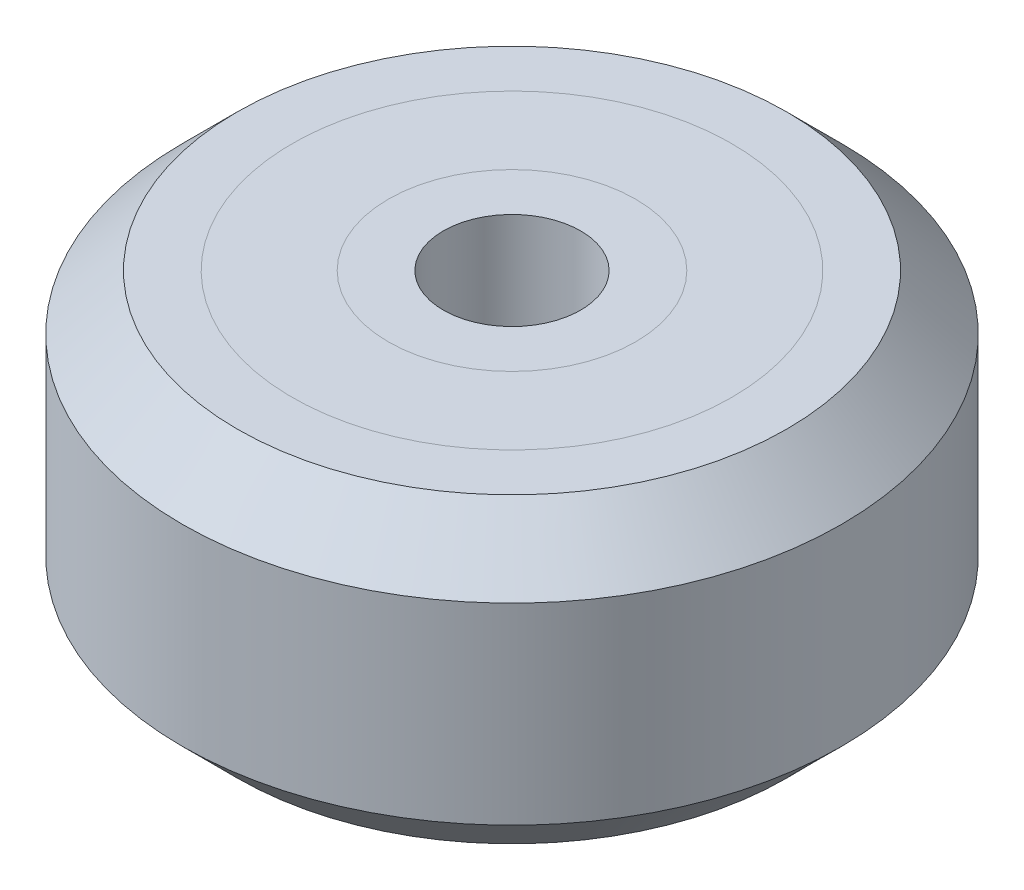
ISO-10303-21;
HEADER;
FILE_DESCRIPTION(('STEP AP214'),'2;1');
FILE_NAME('part.step','',(''),(''),'','','');
FILE_SCHEMA(('AUTOMOTIVE_DESIGN { 1 0 10303 214 1 1 1 1 }'));
ENDSEC;
DATA;
#1=APPLICATION_CONTEXT('core data for automotive mechanical design processes');
#2=APPLICATION_PROTOCOL_DEFINITION('international standard','automotive_design',2000,#1);
#3=PRODUCT_CONTEXT('',#1,'mechanical');
#4=PRODUCT('Part','Part','',(#3));
#5=PRODUCT_RELATED_PRODUCT_CATEGORY('part','',(#4));
#6=PRODUCT_DEFINITION_FORMATION('','',#4);
#7=PRODUCT_DEFINITION_CONTEXT('part definition',#1,'design');
#8=PRODUCT_DEFINITION('design','',#6,#7);
#9=PRODUCT_DEFINITION_SHAPE('','',#8);
#10=(LENGTH_UNIT() NAMED_UNIT(*) SI_UNIT(.MILLI.,.METRE.));
#11=(NAMED_UNIT(*) PLANE_ANGLE_UNIT() SI_UNIT($,.RADIAN.));
#12=(NAMED_UNIT(*) SI_UNIT($,.STERADIAN.) SOLID_ANGLE_UNIT());
#13=UNCERTAINTY_MEASURE_WITH_UNIT(LENGTH_MEASURE(1.E-05),#10,'distance_accuracy_value','');
#14=(GEOMETRIC_REPRESENTATION_CONTEXT(3) GLOBAL_UNCERTAINTY_ASSIGNED_CONTEXT((#13)) GLOBAL_UNIT_ASSIGNED_CONTEXT((#10,
#11,#12)) REPRESENTATION_CONTEXT('',''));
#15=CARTESIAN_POINT('',(0.,0.,0.));
#16=DIRECTION('',(0.,0.,1.));
#17=DIRECTION('',(1.,0.,0.));
#18=AXIS2_PLACEMENT_3D('',#15,#16,#17);
#19=CARTESIAN_POINT('',(0.,0.,0.));
#20=DIRECTION('',(0.,1.,0.));
#21=DIRECTION('',(1.,0.,0.));
#22=AXIS2_PLACEMENT_3D('',#19,#20,#21);
#23=CYLINDRICAL_SURFACE('',#22,2.5);
#24=CARTESIAN_POINT('',(0.,11.,0.));
#25=DIRECTION('',(0.,-1.,0.));
#26=DIRECTION('',(1.,0.,0.));
#27=AXIS2_PLACEMENT_3D('',#24,#25,#26);
#28=CIRCLE('',#27,2.5);
#29=CARTESIAN_POINT('',(-2.5,11.,0.));
#30=VERTEX_POINT('',#29);
#31=EDGE_CURVE('P0_E25',#30,#30,#28,.T.);
#32=ORIENTED_EDGE('',*,*,#31,.F.);
#33=DIRECTION('',(0.,-1.,0.));
#34=VECTOR('',#33,1.);
#35=CARTESIAN_POINT('',(-2.5,0.,0.));
#36=LINE('',#35,#34);
#37=CARTESIAN_POINT('',(-2.5,0.,0.));
#38=VERTEX_POINT('',#37);
#39=EDGE_CURVE('P0_E11',#30,#38,#36,.T.);
#40=ORIENTED_EDGE('',*,*,#39,.T.);
#41=CARTESIAN_POINT('',(0.,0.,0.));
#42=DIRECTION('',(0.,-1.,0.));
#43=DIRECTION('',(1.,0.,0.));
#44=AXIS2_PLACEMENT_3D('',#41,#42,#43);
#45=CIRCLE('',#44,2.5);
#46=EDGE_CURVE('P0_E70',#38,#38,#45,.T.);
#47=ORIENTED_EDGE('',*,*,#46,.T.);
#48=ORIENTED_EDGE('',*,*,#39,.F.);
#49=EDGE_LOOP('',(#32,#40,#47,#48));
#50=FACE_BOUND('',#49,.T.);
#51=ADVANCED_FACE('P0_F17',(#50),#23,.F.);
#52=CARTESIAN_POINT('',(0.,11.,0.));
#53=DIRECTION('',(0.,1.,0.));
#54=DIRECTION('',(1.,0.,0.));
#55=AXIS2_PLACEMENT_3D('',#52,#53,#54);
#56=PLANE('',#55);
#57=ORIENTED_EDGE('',*,*,#31,.T.);
#58=EDGE_LOOP('',(#57));
#59=FACE_BOUND('',#58,.T.);
#60=CARTESIAN_POINT('',(0.,11.,0.));
#61=DIRECTION('',(0.,1.,0.));
#62=DIRECTION('',(-1.,0.,0.));
#63=AXIS2_PLACEMENT_3D('',#60,#61,#62);
#64=CIRCLE('',#63,4.5);
#65=CARTESIAN_POINT('',(4.5,11.,0.));
#66=VERTEX_POINT('',#65);
#67=EDGE_CURVE('P0_E54',#66,#66,#64,.T.);
#68=ORIENTED_EDGE('',*,*,#67,.T.);
#69=EDGE_LOOP('',(#68));
#70=FACE_BOUND('',#69,.T.);
#71=ADVANCED_FACE('P0_F58',(#59,#70),#56,.T.);
#72=CARTESIAN_POINT('',(0.,0.,0.));
#73=DIRECTION('',(0.,1.,0.));
#74=DIRECTION('',(1.,0.,0.));
#75=AXIS2_PLACEMENT_3D('',#72,#73,#74);
#76=PLANE('',#75);
#77=ORIENTED_EDGE('',*,*,#46,.F.);
#78=EDGE_LOOP('',(#77));
#79=FACE_BOUND('',#78,.T.);
#80=CARTESIAN_POINT('',(0.,0.,0.));
#81=DIRECTION('',(0.,-1.,0.));
#82=DIRECTION('',(-1.,0.,0.));
#83=AXIS2_PLACEMENT_3D('',#80,#81,#82);
#84=CIRCLE('',#83,4.5);
#85=CARTESIAN_POINT('',(4.5,0.,0.));
#86=VERTEX_POINT('',#85);
#87=EDGE_CURVE('P0_E57',#86,#86,#84,.T.);
#88=ORIENTED_EDGE('',*,*,#87,.T.);
#89=EDGE_LOOP('',(#88));
#90=FACE_BOUND('',#89,.T.);
#91=ADVANCED_FACE('P0_F73',(#79,#90),#76,.F.);
#92=CARTESIAN_POINT('',(0.,11.,0.));
#93=DIRECTION('',(0.,-1.,0.));
#94=DIRECTION('',(-1.,0.,0.));
#95=AXIS2_PLACEMENT_3D('',#92,#93,#94);
#96=CYLINDRICAL_SURFACE('',#95,4.5);
#97=ORIENTED_EDGE('',*,*,#67,.F.);
#98=DIRECTION('',(0.,-1.,0.));
#99=VECTOR('',#98,1.);
#100=CARTESIAN_POINT('',(4.5,11.,0.));
#101=LINE('',#100,#99);
#102=EDGE_CURVE('P0_E55',#66,#86,#101,.T.);
#103=ORIENTED_EDGE('',*,*,#102,.T.);
#104=ORIENTED_EDGE('',*,*,#87,.F.);
#105=ORIENTED_EDGE('',*,*,#102,.F.);
#106=EDGE_LOOP('',(#97,#103,#104,#105));
#107=FACE_BOUND('',#106,.T.);
#108=ADVANCED_FACE('P0_F53',(#107),#96,.T.);
#109=CLOSED_SHELL('',(#51,#71,#91,#108));
#110=MANIFOLD_SOLID_BREP('P0_B1',#109);
#111=CARTESIAN_POINT('',(0.,11.,0.));
#112=DIRECTION('',(0.,-1.,0.));
#113=DIRECTION('',(-1.,0.,0.));
#114=AXIS2_PLACEMENT_3D('',#111,#112,#113);
#115=CYLINDRICAL_SURFACE('',#114,8.);
#116=CARTESIAN_POINT('',(0.,11.,0.));
#117=DIRECTION('',(0.,-1.,0.));
#118=DIRECTION('',(-1.,0.,0.));
#119=AXIS2_PLACEMENT_3D('',#116,#117,#118);
#120=CIRCLE('',#119,8.);
#121=CARTESIAN_POINT('',(8.,11.,0.));
#122=VERTEX_POINT('',#121);
#123=EDGE_CURVE('P1_E80',#122,#122,#120,.T.);
#124=ORIENTED_EDGE('',*,*,#123,.F.);
#125=DIRECTION('',(0.,-1.,0.));
#126=VECTOR('',#125,1.);
#127=CARTESIAN_POINT('',(8.,11.,0.));
#128=LINE('',#127,#126);
#129=CARTESIAN_POINT('',(8.,0.,0.));
#130=VERTEX_POINT('',#129);
#131=EDGE_CURVE('P1_E11',#122,#130,#128,.T.);
#132=ORIENTED_EDGE('',*,*,#131,.T.);
#133=CARTESIAN_POINT('',(0.,0.,0.));
#134=DIRECTION('',(0.,1.,0.));
#135=DIRECTION('',(-1.,0.,0.));
#136=AXIS2_PLACEMENT_3D('',#133,#134,#135);
#137=CIRCLE('',#136,8.);
#138=EDGE_CURVE('P1_E25',#130,#130,#137,.T.);
#139=ORIENTED_EDGE('',*,*,#138,.F.);
#140=ORIENTED_EDGE('',*,*,#131,.F.);
#141=EDGE_LOOP('',(#124,#132,#139,#140));
#142=FACE_BOUND('',#141,.T.);
#143=ADVANCED_FACE('P1_F17',(#142),#115,.F.);
#144=CARTESIAN_POINT('',(0.,0.,0.));
#145=DIRECTION('',(0.,1.,0.));
#146=DIRECTION('',(1.,0.,0.));
#147=AXIS2_PLACEMENT_3D('',#144,#145,#146);
#148=PLANE('',#147);
#149=ORIENTED_EDGE('',*,*,#138,.T.);
#150=EDGE_LOOP('',(#149));
#151=FACE_BOUND('',#150,.T.);
#152=CARTESIAN_POINT('',(0.,0.,0.));
#153=DIRECTION('',(0.,1.,0.));
#154=DIRECTION('',(1.,0.,0.));
#155=AXIS2_PLACEMENT_3D('',#152,#153,#154);
#156=CIRCLE('',#155,10.);
#157=CARTESIAN_POINT('',(-10.,0.,0.));
#158=VERTEX_POINT('',#157);
#159=EDGE_CURVE('P1_E79',#158,#158,#156,.T.);
#160=ORIENTED_EDGE('',*,*,#159,.F.);
#161=EDGE_LOOP('',(#160));
#162=FACE_BOUND('',#161,.T.);
#163=ADVANCED_FACE('P1_F96',(#151,#162),#148,.F.);
#164=CARTESIAN_POINT('',(0.,11.,0.));
#165=DIRECTION('',(0.,1.,0.));
#166=DIRECTION('',(1.,0.,0.));
#167=AXIS2_PLACEMENT_3D('',#164,#165,#166);
#168=PLANE('',#167);
#169=ORIENTED_EDGE('',*,*,#123,.T.);
#170=EDGE_LOOP('',(#169));
#171=FACE_BOUND('',#170,.T.);
#172=CARTESIAN_POINT('',(0.,11.,0.));
#173=DIRECTION('',(0.,-1.,0.));
#174=DIRECTION('',(1.,0.,0.));
#175=AXIS2_PLACEMENT_3D('',#172,#173,#174);
#176=CIRCLE('',#175,10.);
#177=CARTESIAN_POINT('',(-10.,11.,0.));
#178=VERTEX_POINT('',#177);
#179=EDGE_CURVE('P1_E63',#178,#178,#176,.T.);
#180=ORIENTED_EDGE('',*,*,#179,.F.);
#181=EDGE_LOOP('',(#180));
#182=FACE_BOUND('',#181,.T.);
#183=ADVANCED_FACE('P1_F103',(#171,#182),#168,.T.);
#184=CARTESIAN_POINT('',(0.,1.,0.));
#185=DIRECTION('',(0.,1.,0.));
#186=DIRECTION('',(1.,0.,0.));
#187=AXIS2_PLACEMENT_3D('',#184,#185,#186);
#188=CONICAL_SURFACE('',#187,11.,0.785398163397448);
#189=CARTESIAN_POINT('',(0.,2.,0.));
#190=DIRECTION('',(0.,-1.,0.));
#191=DIRECTION('',(1.,0.,0.));
#192=AXIS2_PLACEMENT_3D('',#189,#190,#191);
#193=CIRCLE('',#192,12.);
#194=CARTESIAN_POINT('',(-12.,2.,0.));
#195=VERTEX_POINT('',#194);
#196=EDGE_CURVE('P1_E82',#195,#195,#193,.T.);
#197=ORIENTED_EDGE('',*,*,#196,.T.);
#198=DIRECTION('',(0.707106781186547,-0.707106781186548,0.));
#199=VECTOR('',#198,1.);
#200=CARTESIAN_POINT('',(-11.,1.,0.));
#201=LINE('',#200,#199);
#202=EDGE_CURVE('P1_E86',#195,#158,#201,.T.);
#203=ORIENTED_EDGE('',*,*,#202,.T.);
#204=ORIENTED_EDGE('',*,*,#159,.T.);
#205=ORIENTED_EDGE('',*,*,#202,.F.);
#206=EDGE_LOOP('',(#197,#203,#204,#205));
#207=FACE_BOUND('',#206,.T.);
#208=ADVANCED_FACE('P1_F107',(#207),#188,.T.);
#209=CARTESIAN_POINT('',(0.,0.,0.));
#210=DIRECTION('',(0.,1.,0.));
#211=DIRECTION('',(1.,0.,0.));
#212=AXIS2_PLACEMENT_3D('',#209,#210,#211);
#213=CYLINDRICAL_SURFACE('',#212,12.);
#214=CARTESIAN_POINT('',(0.,9.,0.));
#215=DIRECTION('',(0.,1.,0.));
#216=DIRECTION('',(1.,0.,0.));
#217=AXIS2_PLACEMENT_3D('',#214,#215,#216);
#218=CIRCLE('',#217,12.);
#219=CARTESIAN_POINT('',(-12.,9.,0.));
#220=VERTEX_POINT('',#219);
#221=EDGE_CURVE('P1_E67',#220,#220,#218,.T.);
#222=ORIENTED_EDGE('',*,*,#221,.F.);
#223=DIRECTION('',(0.,-1.,0.));
#224=VECTOR('',#223,1.);
#225=CARTESIAN_POINT('',(-12.,0.,0.));
#226=LINE('',#225,#224);
#227=EDGE_CURVE('P1_E73',#220,#195,#226,.T.);
#228=ORIENTED_EDGE('',*,*,#227,.T.);
#229=ORIENTED_EDGE('',*,*,#196,.F.);
#230=ORIENTED_EDGE('',*,*,#227,.F.);
#231=EDGE_LOOP('',(#222,#228,#229,#230));
#232=FACE_BOUND('',#231,.T.);
#233=ADVANCED_FACE('P1_F114',(#232),#213,.T.);
#234=CARTESIAN_POINT('',(0.,10.,0.));
#235=DIRECTION('',(0.,-1.,0.));
#236=DIRECTION('',(1.,0.,0.));
#237=AXIS2_PLACEMENT_3D('',#234,#235,#236);
#238=CONICAL_SURFACE('',#237,11.,0.785398163397448);
#239=ORIENTED_EDGE('',*,*,#179,.T.);
#240=DIRECTION('',(-0.707106781186548,-0.707106781186548,0.));
#241=VECTOR('',#240,1.);
#242=CARTESIAN_POINT('',(-11.,10.,0.));
#243=LINE('',#242,#241);
#244=EDGE_CURVE('P1_E61',#178,#220,#243,.T.);
#245=ORIENTED_EDGE('',*,*,#244,.T.);
#246=ORIENTED_EDGE('',*,*,#221,.T.);
#247=ORIENTED_EDGE('',*,*,#244,.F.);
#248=EDGE_LOOP('',(#239,#245,#246,#247));
#249=FACE_BOUND('',#248,.T.);
#250=ADVANCED_FACE('P1_F62',(#249),#238,.T.);
#251=CLOSED_SHELL('',(#143,#163,#183,#208,#233,#250));
#252=MANIFOLD_SOLID_BREP('P1_B1',#251);
#253=CARTESIAN_POINT('',(0.,0.,0.));
#254=DIRECTION('',(0.,1.,0.));
#255=DIRECTION('',(1.,0.,0.));
#256=AXIS2_PLACEMENT_3D('',#253,#254,#255);
#257=PLANE('',#256);
#258=CARTESIAN_POINT('',(0.,0.,0.));
#259=DIRECTION('',(0.,1.,0.));
#260=DIRECTION('',(-1.,0.,0.));
#261=AXIS2_PLACEMENT_3D('',#258,#259,#260);
#262=CIRCLE('',#261,4.5);
#263=CARTESIAN_POINT('',(4.5,0.,0.));
#264=VERTEX_POINT('',#263);
#265=EDGE_CURVE('P2_E59',#264,#264,#262,.T.);
#266=ORIENTED_EDGE('',*,*,#265,.T.);
#267=EDGE_LOOP('',(#266));
#268=FACE_BOUND('',#267,.T.);
#269=CARTESIAN_POINT('',(0.,0.,0.));
#270=DIRECTION('',(0.,-1.,0.));
#271=DIRECTION('',(-1.,0.,0.));
#272=AXIS2_PLACEMENT_3D('',#269,#270,#271);
#273=CIRCLE('',#272,8.);
#274=CARTESIAN_POINT('',(8.,0.,0.));
#275=VERTEX_POINT('',#274);
#276=EDGE_CURVE('P2_E67',#275,#275,#273,.T.);
#277=ORIENTED_EDGE('',*,*,#276,.T.);
#278=EDGE_LOOP('',(#277));
#279=FACE_BOUND('',#278,.T.);
#280=ADVANCED_FACE('P2_F17',(#268,#279),#257,.F.);
#281=CARTESIAN_POINT('',(0.,11.,0.));
#282=DIRECTION('',(0.,1.,0.));
#283=DIRECTION('',(1.,0.,0.));
#284=AXIS2_PLACEMENT_3D('',#281,#282,#283);
#285=PLANE('',#284);
#286=CARTESIAN_POINT('',(0.,11.,0.));
#287=DIRECTION('',(0.,-1.,0.));
#288=DIRECTION('',(-1.,0.,0.));
#289=AXIS2_PLACEMENT_3D('',#286,#287,#288);
#290=CIRCLE('',#289,4.5);
#291=CARTESIAN_POINT('',(4.5,11.,0.));
#292=VERTEX_POINT('',#291);
#293=EDGE_CURVE('P2_E56',#292,#292,#290,.T.);
#294=ORIENTED_EDGE('',*,*,#293,.T.);
#295=EDGE_LOOP('',(#294));
#296=FACE_BOUND('',#295,.T.);
#297=CARTESIAN_POINT('',(0.,11.,0.));
#298=DIRECTION('',(0.,1.,0.));
#299=DIRECTION('',(-1.,0.,0.));
#300=AXIS2_PLACEMENT_3D('',#297,#298,#299);
#301=CIRCLE('',#300,8.);
#302=CARTESIAN_POINT('',(8.,11.,0.));
#303=VERTEX_POINT('',#302);
#304=EDGE_CURVE('P2_E11',#303,#303,#301,.T.);
#305=ORIENTED_EDGE('',*,*,#304,.T.);
#306=EDGE_LOOP('',(#305));
#307=FACE_BOUND('',#306,.T.);
#308=ADVANCED_FACE('P2_F80',(#296,#307),#285,.T.);
#309=CARTESIAN_POINT('',(0.,11.,0.));
#310=DIRECTION('',(0.,-1.,0.));
#311=DIRECTION('',(-1.,0.,0.));
#312=AXIS2_PLACEMENT_3D('',#309,#310,#311);
#313=CYLINDRICAL_SURFACE('',#312,8.);
#314=ORIENTED_EDGE('',*,*,#276,.F.);
#315=DIRECTION('',(0.,1.,0.));
#316=VECTOR('',#315,1.);
#317=CARTESIAN_POINT('',(8.,11.,0.));
#318=LINE('',#317,#316);
#319=EDGE_CURVE('P2_E20',#275,#303,#318,.T.);
#320=ORIENTED_EDGE('',*,*,#319,.T.);
#321=ORIENTED_EDGE('',*,*,#304,.F.);
#322=ORIENTED_EDGE('',*,*,#319,.F.);
#323=EDGE_LOOP('',(#314,#320,#321,#322));
#324=FACE_BOUND('',#323,.T.);
#325=ADVANCED_FACE('P2_F74',(#324),#313,.T.);
#326=CARTESIAN_POINT('',(0.,11.,0.));
#327=DIRECTION('',(0.,-1.,0.));
#328=DIRECTION('',(-1.,0.,0.));
#329=AXIS2_PLACEMENT_3D('',#326,#327,#328);
#330=CYLINDRICAL_SURFACE('',#329,4.5);
#331=ORIENTED_EDGE('',*,*,#265,.F.);
#332=DIRECTION('',(0.,1.,0.));
#333=VECTOR('',#332,1.);
#334=CARTESIAN_POINT('',(4.5,11.,0.));
#335=LINE('',#334,#333);
#336=EDGE_CURVE('P2_E54',#264,#292,#335,.T.);
#337=ORIENTED_EDGE('',*,*,#336,.T.);
#338=ORIENTED_EDGE('',*,*,#293,.F.);
#339=ORIENTED_EDGE('',*,*,#336,.F.);
#340=EDGE_LOOP('',(#331,#337,#338,#339));
#341=FACE_BOUND('',#340,.T.);
#342=ADVANCED_FACE('P2_F60',(#341),#330,.F.);
#343=CLOSED_SHELL('',(#280,#308,#325,#342));
#344=MANIFOLD_SOLID_BREP('P2_B1',#343);
#345=ADVANCED_BREP_SHAPE_REPRESENTATION('',(#18,#110,#252,#344),#14);
#346=SHAPE_DEFINITION_REPRESENTATION(#9,#345);
ENDSEC;
END-ISO-10303-21;
